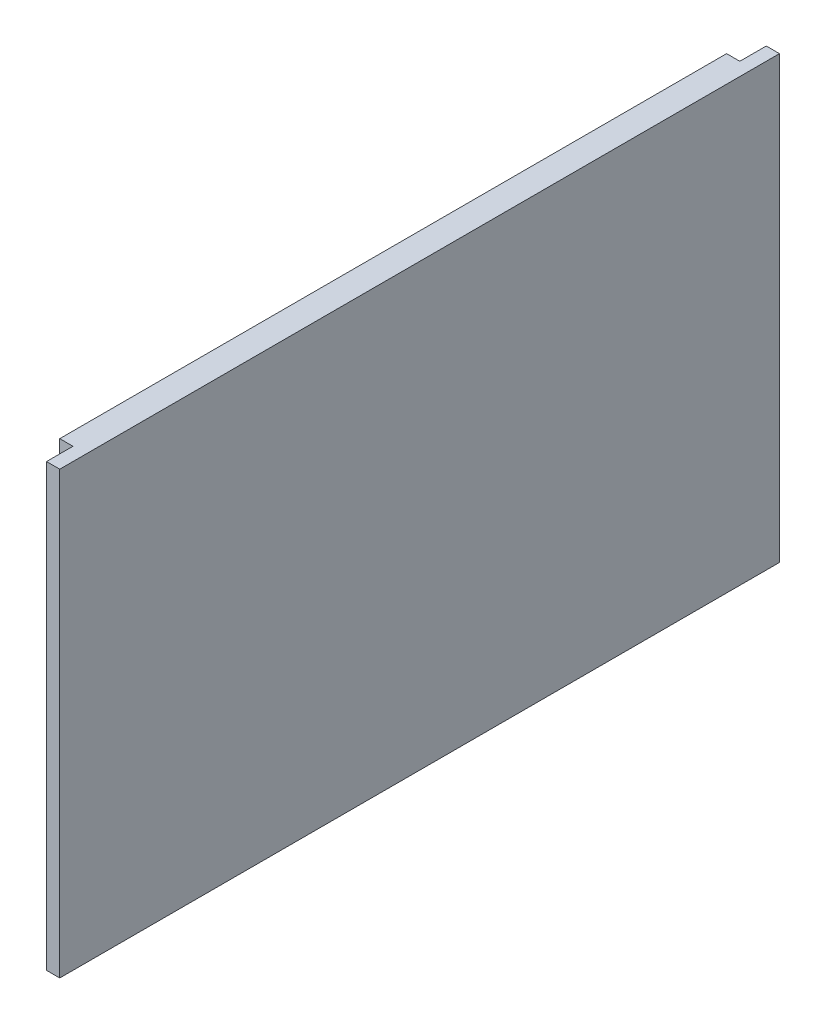
ISO-10303-21;
HEADER;
FILE_DESCRIPTION(('STEP AP214'),'2;1');
FILE_NAME('part.step','',(''),(''),'','','');
FILE_SCHEMA(('AUTOMOTIVE_DESIGN { 1 0 10303 214 1 1 1 1 }'));
ENDSEC;
DATA;
#1=APPLICATION_CONTEXT('core data for automotive mechanical design processes');
#2=APPLICATION_PROTOCOL_DEFINITION('international standard','automotive_design',2000,#1);
#3=PRODUCT_CONTEXT('',#1,'mechanical');
#4=PRODUCT('Part','Part','',(#3));
#5=PRODUCT_RELATED_PRODUCT_CATEGORY('part','',(#4));
#6=PRODUCT_DEFINITION_FORMATION('','',#4);
#7=PRODUCT_DEFINITION_CONTEXT('part definition',#1,'design');
#8=PRODUCT_DEFINITION('design','',#6,#7);
#9=PRODUCT_DEFINITION_SHAPE('','',#8);
#10=(LENGTH_UNIT() NAMED_UNIT(*) SI_UNIT(.MILLI.,.METRE.));
#11=(NAMED_UNIT(*) PLANE_ANGLE_UNIT() SI_UNIT($,.RADIAN.));
#12=(NAMED_UNIT(*) SI_UNIT($,.STERADIAN.) SOLID_ANGLE_UNIT());
#13=UNCERTAINTY_MEASURE_WITH_UNIT(LENGTH_MEASURE(1.E-05),#10,'distance_accuracy_value','');
#14=(GEOMETRIC_REPRESENTATION_CONTEXT(3) GLOBAL_UNCERTAINTY_ASSIGNED_CONTEXT((#13)) GLOBAL_UNIT_ASSIGNED_CONTEXT((#10,
#11,#12)) REPRESENTATION_CONTEXT('',''));
#15=CARTESIAN_POINT('',(0.,0.,0.));
#16=DIRECTION('',(0.,0.,1.));
#17=DIRECTION('',(1.,0.,0.));
#18=AXIS2_PLACEMENT_3D('',#15,#16,#17);
#19=CARTESIAN_POINT('',(18.,0.,-490.));
#20=DIRECTION('',(0.,0.,1.));
#21=DIRECTION('',(1.,0.,0.));
#22=AXIS2_PLACEMENT_3D('',#19,#20,#21);
#23=PLANE('',#22);
#24=DIRECTION('',(0.,-1.,0.));
#25=VECTOR('',#24,1.);
#26=CARTESIAN_POINT('',(9.,300.,-490.));
#27=LINE('',#26,#25);
#28=CARTESIAN_POINT('',(9.,300.,-490.));
#29=VERTEX_POINT('',#28);
#30=CARTESIAN_POINT('',(9.,0.,-490.));
#31=VERTEX_POINT('',#30);
#32=EDGE_CURVE('E98',#29,#31,#27,.T.);
#33=ORIENTED_EDGE('',*,*,#32,.F.);
#34=DIRECTION('',(-1.,0.,0.));
#35=VECTOR('',#34,1.);
#36=CARTESIAN_POINT('',(18.,300.,-490.));
#37=LINE('',#36,#35);
#38=CARTESIAN_POINT('',(18.,300.,-490.));
#39=VERTEX_POINT('',#38);
#40=EDGE_CURVE('E119',#39,#29,#37,.T.);
#41=ORIENTED_EDGE('',*,*,#40,.F.);
#42=DIRECTION('',(0.,1.,0.));
#43=VECTOR('',#42,1.);
#44=CARTESIAN_POINT('',(18.,0.,-490.));
#45=LINE('',#44,#43);
#46=CARTESIAN_POINT('',(18.,0.,-490.));
#47=VERTEX_POINT('',#46);
#48=EDGE_CURVE('E118',#47,#39,#45,.T.);
#49=ORIENTED_EDGE('',*,*,#48,.F.);
#50=DIRECTION('',(-1.,0.,0.));
#51=VECTOR('',#50,1.);
#52=CARTESIAN_POINT('',(18.,0.,-490.));
#53=LINE('',#52,#51);
#54=EDGE_CURVE('E41',#47,#31,#53,.T.);
#55=ORIENTED_EDGE('',*,*,#54,.T.);
#56=EDGE_LOOP('',(#33,#41,#49,#55));
#57=FACE_BOUND('',#56,.T.);
#58=ADVANCED_FACE('F33',(#57),#23,.F.);
#59=CARTESIAN_POINT('',(0.,0.,0.));
#60=DIRECTION('',(-1.,0.,0.));
#61=DIRECTION('',(0.,0.,1.));
#62=AXIS2_PLACEMENT_3D('',#59,#60,#61);
#63=PLANE('',#62);
#64=DIRECTION('',(0.,1.,0.));
#65=VECTOR('',#64,1.);
#66=CARTESIAN_POINT('',(0.,300.,-472.));
#67=LINE('',#66,#65);
#68=CARTESIAN_POINT('',(0.,0.,-472.));
#69=VERTEX_POINT('',#68);
#70=CARTESIAN_POINT('',(0.,300.,-472.));
#71=VERTEX_POINT('',#70);
#72=EDGE_CURVE('E109',#69,#71,#67,.T.);
#73=ORIENTED_EDGE('',*,*,#72,.F.);
#74=DIRECTION('',(0.,0.,-1.));
#75=VECTOR('',#74,1.);
#76=CARTESIAN_POINT('',(0.,0.,0.));
#77=LINE('',#76,#75);
#78=CARTESIAN_POINT('',(0.,0.,-18.));
#79=VERTEX_POINT('',#78);
#80=EDGE_CURVE('E128',#79,#69,#77,.T.);
#81=ORIENTED_EDGE('',*,*,#80,.F.);
#82=DIRECTION('',(0.,-1.,0.));
#83=VECTOR('',#82,1.);
#84=CARTESIAN_POINT('',(0.,300.,-18.));
#85=LINE('',#84,#83);
#86=CARTESIAN_POINT('',(0.,300.,-18.));
#87=VERTEX_POINT('',#86);
#88=EDGE_CURVE('E144',#87,#79,#85,.T.);
#89=ORIENTED_EDGE('',*,*,#88,.F.);
#90=DIRECTION('',(0.,0.,1.));
#91=VECTOR('',#90,1.);
#92=CARTESIAN_POINT('',(0.,300.,0.));
#93=LINE('',#92,#91);
#94=EDGE_CURVE('E56',#71,#87,#93,.T.);
#95=ORIENTED_EDGE('',*,*,#94,.F.);
#96=EDGE_LOOP('',(#73,#81,#89,#95));
#97=FACE_BOUND('',#96,.T.);
#98=ADVANCED_FACE('F165',(#97),#63,.T.);
#99=CARTESIAN_POINT('',(18.,0.,0.));
#100=DIRECTION('',(0.,0.,-1.));
#101=DIRECTION('',(-1.,0.,0.));
#102=AXIS2_PLACEMENT_3D('',#99,#100,#101);
#103=PLANE('',#102);
#104=DIRECTION('',(-1.,0.,0.));
#105=VECTOR('',#104,1.);
#106=CARTESIAN_POINT('',(18.,300.,0.));
#107=LINE('',#106,#105);
#108=CARTESIAN_POINT('',(18.,300.,0.));
#109=VERTEX_POINT('',#108);
#110=CARTESIAN_POINT('',(9.,300.,0.));
#111=VERTEX_POINT('',#110);
#112=EDGE_CURVE('E120',#109,#111,#107,.T.);
#113=ORIENTED_EDGE('',*,*,#112,.T.);
#114=DIRECTION('',(0.,1.,0.));
#115=VECTOR('',#114,1.);
#116=CARTESIAN_POINT('',(9.,300.,0.));
#117=LINE('',#116,#115);
#118=CARTESIAN_POINT('',(9.00000000000004,0.,0.));
#119=VERTEX_POINT('',#118);
#120=EDGE_CURVE('E142',#119,#111,#117,.T.);
#121=ORIENTED_EDGE('',*,*,#120,.F.);
#122=DIRECTION('',(-1.,0.,0.));
#123=VECTOR('',#122,1.);
#124=CARTESIAN_POINT('',(18.,0.,0.));
#125=LINE('',#124,#123);
#126=CARTESIAN_POINT('',(18.,0.,0.));
#127=VERTEX_POINT('',#126);
#128=EDGE_CURVE('E11',#127,#119,#125,.T.);
#129=ORIENTED_EDGE('',*,*,#128,.F.);
#130=DIRECTION('',(0.,-1.,0.));
#131=VECTOR('',#130,1.);
#132=CARTESIAN_POINT('',(18.,0.,0.));
#133=LINE('',#132,#131);
#134=EDGE_CURVE('E127',#109,#127,#133,.T.);
#135=ORIENTED_EDGE('',*,*,#134,.F.);
#136=EDGE_LOOP('',(#113,#121,#129,#135));
#137=FACE_BOUND('',#136,.T.);
#138=ADVANCED_FACE('F35',(#137),#103,.F.);
#139=CARTESIAN_POINT('',(18.,0.,0.));
#140=DIRECTION('',(0.,1.,0.));
#141=DIRECTION('',(0.,0.,1.));
#142=AXIS2_PLACEMENT_3D('',#139,#140,#141);
#143=PLANE('',#142);
#144=ORIENTED_EDGE('',*,*,#80,.T.);
#145=DIRECTION('',(-1.,0.,0.));
#146=VECTOR('',#145,1.);
#147=CARTESIAN_POINT('',(9.,0.,-472.));
#148=LINE('',#147,#146);
#149=CARTESIAN_POINT('',(9.,0.,-472.));
#150=VERTEX_POINT('',#149);
#151=EDGE_CURVE('E116',#150,#69,#148,.T.);
#152=ORIENTED_EDGE('',*,*,#151,.F.);
#153=DIRECTION('',(0.,0.,1.));
#154=VECTOR('',#153,1.);
#155=CARTESIAN_POINT('',(9.,0.,-490.));
#156=LINE('',#155,#154);
#157=EDGE_CURVE('E101',#31,#150,#156,.T.);
#158=ORIENTED_EDGE('',*,*,#157,.F.);
#159=ORIENTED_EDGE('',*,*,#54,.F.);
#160=DIRECTION('',(0.,0.,-1.));
#161=VECTOR('',#160,1.);
#162=CARTESIAN_POINT('',(18.,0.,0.));
#163=LINE('',#162,#161);
#164=EDGE_CURVE('E133',#127,#47,#163,.T.);
#165=ORIENTED_EDGE('',*,*,#164,.F.);
#166=ORIENTED_EDGE('',*,*,#128,.T.);
#167=DIRECTION('',(0.,0.,1.));
#168=VECTOR('',#167,1.);
#169=CARTESIAN_POINT('',(9.00000000000004,0.,-18.));
#170=LINE('',#169,#168);
#171=CARTESIAN_POINT('',(9.00000000000004,0.,-18.));
#172=VERTEX_POINT('',#171);
#173=EDGE_CURVE('E137',#172,#119,#170,.T.);
#174=ORIENTED_EDGE('',*,*,#173,.F.);
#175=DIRECTION('',(1.,0.,0.));
#176=VECTOR('',#175,1.);
#177=CARTESIAN_POINT('',(0.,0.,-18.));
#178=LINE('',#177,#176);
#179=EDGE_CURVE('E150',#79,#172,#178,.T.);
#180=ORIENTED_EDGE('',*,*,#179,.F.);
#181=EDGE_LOOP('',(#144,#152,#158,#159,#165,#166,#174,#180));
#182=FACE_BOUND('',#181,.T.);
#183=ADVANCED_FACE('F114',(#182),#143,.F.);
#184=CARTESIAN_POINT('',(18.,300.,0.));
#185=DIRECTION('',(0.,-1.,0.));
#186=DIRECTION('',(0.,0.,-1.));
#187=AXIS2_PLACEMENT_3D('',#184,#185,#186);
#188=PLANE('',#187);
#189=DIRECTION('',(0.,0.,-1.));
#190=VECTOR('',#189,1.);
#191=CARTESIAN_POINT('',(9.,300.,-490.));
#192=LINE('',#191,#190);
#193=CARTESIAN_POINT('',(9.,300.,-472.));
#194=VERTEX_POINT('',#193);
#195=EDGE_CURVE('E104',#194,#29,#192,.T.);
#196=ORIENTED_EDGE('',*,*,#195,.F.);
#197=DIRECTION('',(-1.,0.,0.));
#198=VECTOR('',#197,1.);
#199=CARTESIAN_POINT('',(9.,300.,-472.));
#200=LINE('',#199,#198);
#201=EDGE_CURVE('E145',#194,#71,#200,.T.);
#202=ORIENTED_EDGE('',*,*,#201,.T.);
#203=ORIENTED_EDGE('',*,*,#94,.T.);
#204=DIRECTION('',(-1.,0.,0.));
#205=VECTOR('',#204,1.);
#206=CARTESIAN_POINT('',(0.,300.,-18.));
#207=LINE('',#206,#205);
#208=CARTESIAN_POINT('',(9.,300.,-18.));
#209=VERTEX_POINT('',#208);
#210=EDGE_CURVE('E139',#209,#87,#207,.T.);
#211=ORIENTED_EDGE('',*,*,#210,.F.);
#212=DIRECTION('',(0.,0.,1.));
#213=VECTOR('',#212,1.);
#214=CARTESIAN_POINT('',(9.,300.,-18.));
#215=LINE('',#214,#213);
#216=EDGE_CURVE('E130',#209,#111,#215,.T.);
#217=ORIENTED_EDGE('',*,*,#216,.T.);
#218=ORIENTED_EDGE('',*,*,#112,.F.);
#219=DIRECTION('',(0.,0.,1.));
#220=VECTOR('',#219,1.);
#221=CARTESIAN_POINT('',(18.,300.,0.));
#222=LINE('',#221,#220);
#223=EDGE_CURVE('E125',#39,#109,#222,.T.);
#224=ORIENTED_EDGE('',*,*,#223,.F.);
#225=ORIENTED_EDGE('',*,*,#40,.T.);
#226=EDGE_LOOP('',(#196,#202,#203,#211,#217,#218,#224,#225));
#227=FACE_BOUND('',#226,.T.);
#228=ADVANCED_FACE('F163',(#227),#188,.F.);
#229=CARTESIAN_POINT('',(18.,0.,0.));
#230=DIRECTION('',(-1.,0.,0.));
#231=DIRECTION('',(0.,0.,1.));
#232=AXIS2_PLACEMENT_3D('',#229,#230,#231);
#233=PLANE('',#232);
#234=ORIENTED_EDGE('',*,*,#134,.T.);
#235=ORIENTED_EDGE('',*,*,#164,.T.);
#236=ORIENTED_EDGE('',*,*,#48,.T.);
#237=ORIENTED_EDGE('',*,*,#223,.T.);
#238=EDGE_LOOP('',(#234,#235,#236,#237));
#239=FACE_BOUND('',#238,.T.);
#240=ADVANCED_FACE('F179',(#239),#233,.F.);
#241=CARTESIAN_POINT('',(9.,300.,-18.));
#242=DIRECTION('',(1.,0.,0.));
#243=DIRECTION('',(0.,1.,0.));
#244=AXIS2_PLACEMENT_3D('',#241,#242,#243);
#245=PLANE('',#244);
#246=ORIENTED_EDGE('',*,*,#120,.T.);
#247=ORIENTED_EDGE('',*,*,#216,.F.);
#248=DIRECTION('',(0.,1.,0.));
#249=VECTOR('',#248,1.);
#250=CARTESIAN_POINT('',(9.,300.,-18.));
#251=LINE('',#250,#249);
#252=EDGE_CURVE('E147',#172,#209,#251,.T.);
#253=ORIENTED_EDGE('',*,*,#252,.F.);
#254=ORIENTED_EDGE('',*,*,#173,.T.);
#255=EDGE_LOOP('',(#246,#247,#253,#254));
#256=FACE_BOUND('',#255,.T.);
#257=ADVANCED_FACE('F173',(#256),#245,.F.);
#258=CARTESIAN_POINT('',(0.,0.,-18.));
#259=DIRECTION('',(0.,0.,1.));
#260=DIRECTION('',(1.,0.,0.));
#261=AXIS2_PLACEMENT_3D('',#258,#259,#260);
#262=PLANE('',#261);
#263=ORIENTED_EDGE('',*,*,#88,.T.);
#264=ORIENTED_EDGE('',*,*,#179,.T.);
#265=ORIENTED_EDGE('',*,*,#252,.T.);
#266=ORIENTED_EDGE('',*,*,#210,.T.);
#267=EDGE_LOOP('',(#263,#264,#265,#266));
#268=FACE_BOUND('',#267,.T.);
#269=ADVANCED_FACE('F168',(#268),#262,.T.);
#270=CARTESIAN_POINT('',(9.,300.,-472.));
#271=DIRECTION('',(0.,0.,1.));
#272=DIRECTION('',(0.,-1.,0.));
#273=AXIS2_PLACEMENT_3D('',#270,#271,#272);
#274=PLANE('',#273);
#275=ORIENTED_EDGE('',*,*,#72,.T.);
#276=ORIENTED_EDGE('',*,*,#201,.F.);
#277=DIRECTION('',(0.,1.,0.));
#278=VECTOR('',#277,1.);
#279=CARTESIAN_POINT('',(9.,300.,-472.));
#280=LINE('',#279,#278);
#281=EDGE_CURVE('E48',#150,#194,#280,.T.);
#282=ORIENTED_EDGE('',*,*,#281,.F.);
#283=ORIENTED_EDGE('',*,*,#151,.T.);
#284=EDGE_LOOP('',(#275,#276,#282,#283));
#285=FACE_BOUND('',#284,.T.);
#286=ADVANCED_FACE('F160',(#285),#274,.F.);
#287=CARTESIAN_POINT('',(9.,0.,0.));
#288=DIRECTION('',(-1.,0.,0.));
#289=DIRECTION('',(0.,0.,1.));
#290=AXIS2_PLACEMENT_3D('',#287,#288,#289);
#291=PLANE('',#290);
#292=ORIENTED_EDGE('',*,*,#32,.T.);
#293=ORIENTED_EDGE('',*,*,#157,.T.);
#294=ORIENTED_EDGE('',*,*,#281,.T.);
#295=ORIENTED_EDGE('',*,*,#195,.T.);
#296=EDGE_LOOP('',(#292,#293,#294,#295));
#297=FACE_BOUND('',#296,.T.);
#298=ADVANCED_FACE('F100',(#297),#291,.T.);
#299=CLOSED_SHELL('',(#58,#98,#138,#183,#228,#240,#257,#269,#286,#298));
#300=MANIFOLD_SOLID_BREP('B2',#299);
#301=ADVANCED_BREP_SHAPE_REPRESENTATION('',(#18,#300),#14);
#302=SHAPE_DEFINITION_REPRESENTATION(#9,#301);
ENDSEC;
END-ISO-10303-21;
